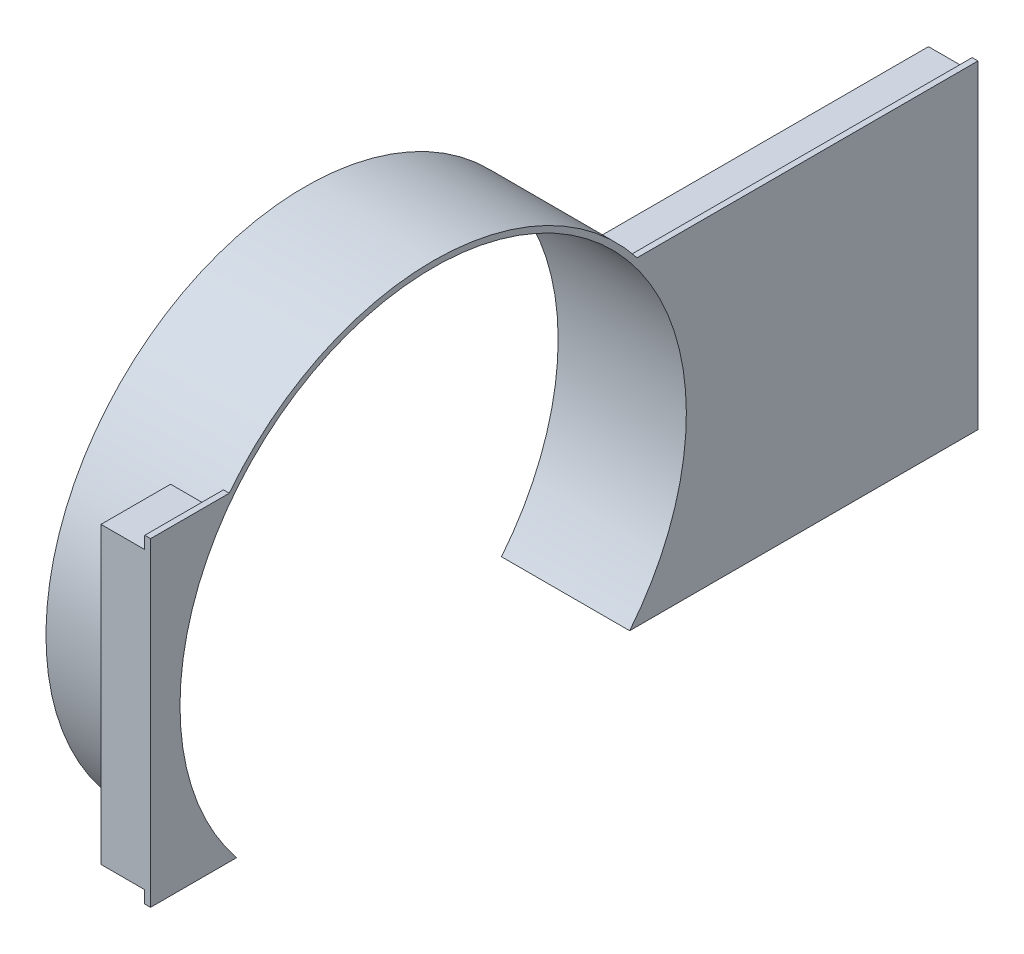
ISO-10303-21;
HEADER;
FILE_DESCRIPTION(('STEP AP214'),'2;1');
FILE_NAME('part.step','',(''),(''),'','','');
FILE_SCHEMA(('AUTOMOTIVE_DESIGN { 1 0 10303 214 1 1 1 1 }'));
ENDSEC;
DATA;
#1=APPLICATION_CONTEXT('core data for automotive mechanical design processes');
#2=APPLICATION_PROTOCOL_DEFINITION('international standard','automotive_design',2000,#1);
#3=PRODUCT_CONTEXT('',#1,'mechanical');
#4=PRODUCT('Part','Part','',(#3));
#5=PRODUCT_RELATED_PRODUCT_CATEGORY('part','',(#4));
#6=PRODUCT_DEFINITION_FORMATION('','',#4);
#7=PRODUCT_DEFINITION_CONTEXT('part definition',#1,'design');
#8=PRODUCT_DEFINITION('design','',#6,#7);
#9=PRODUCT_DEFINITION_SHAPE('','',#8);
#10=(LENGTH_UNIT() NAMED_UNIT(*) SI_UNIT(.MILLI.,.METRE.));
#11=(NAMED_UNIT(*) PLANE_ANGLE_UNIT() SI_UNIT($,.RADIAN.));
#12=(NAMED_UNIT(*) SI_UNIT($,.STERADIAN.) SOLID_ANGLE_UNIT());
#13=UNCERTAINTY_MEASURE_WITH_UNIT(LENGTH_MEASURE(1.E-05),#10,'distance_accuracy_value','');
#14=(GEOMETRIC_REPRESENTATION_CONTEXT(3) GLOBAL_UNCERTAINTY_ASSIGNED_CONTEXT((#13)) GLOBAL_UNIT_ASSIGNED_CONTEXT((#10,
#11,#12)) REPRESENTATION_CONTEXT('',''));
#15=CARTESIAN_POINT('',(0.,0.,0.));
#16=DIRECTION('',(0.,0.,1.));
#17=DIRECTION('',(1.,0.,0.));
#18=AXIS2_PLACEMENT_3D('',#15,#16,#17);
#19=CARTESIAN_POINT('',(0.,0.,0.));
#20=DIRECTION('',(1.,0.,0.));
#21=DIRECTION('',(0.,0.,-1.));
#22=AXIS2_PLACEMENT_3D('',#19,#20,#21);
#23=PLANE('',#22);
#24=DIRECTION('',(0.,-1.,0.));
#25=VECTOR('',#24,1.);
#26=CARTESIAN_POINT('',(0.,102.809999999998,119.460000064));
#27=LINE('',#26,#25);
#28=CARTESIAN_POINT('',(0.,102.809999999998,119.460000064));
#29=VERTEX_POINT('',#28);
#30=CARTESIAN_POINT('',(0.,6.78999988199818,119.460000064));
#31=VERTEX_POINT('',#30);
#32=EDGE_CURVE('E247',#29,#31,#27,.T.);
#33=ORIENTED_EDGE('',*,*,#32,.F.);
#34=DIRECTION('',(0.,0.,1.));
#35=VECTOR('',#34,1.);
#36=CARTESIAN_POINT('',(0.,102.809999999998,122.000000064));
#37=LINE('',#36,#35);
#38=CARTESIAN_POINT('',(0.,102.809999999998,99.8214534742541));
#39=VERTEX_POINT('',#38);
#40=EDGE_CURVE('E255',#39,#29,#37,.T.);
#41=ORIENTED_EDGE('',*,*,#40,.F.);
#42=CARTESIAN_POINT('',(0.,54.7999999999982,25.));
#43=DIRECTION('',(-1.,0.,0.));
#44=DIRECTION('',(0.,0.,-1.));
#45=AXIS2_PLACEMENT_3D('',#42,#43,#44);
#46=CIRCLE('',#45,88.9);
#47=CARTESIAN_POINT('',(0.,6.78999988199817,99.8214533985383));
#48=VERTEX_POINT('',#47);
#49=EDGE_CURVE('E368',#48,#39,#46,.T.);
#50=ORIENTED_EDGE('',*,*,#49,.F.);
#51=DIRECTION('',(0.,0.,-1.));
#52=VECTOR('',#51,1.);
#53=CARTESIAN_POINT('',(0.,6.78999988199818,122.000000064));
#54=LINE('',#53,#52);
#55=EDGE_CURVE('E284',#31,#48,#54,.T.);
#56=ORIENTED_EDGE('',*,*,#55,.F.);
#57=EDGE_LOOP('',(#33,#41,#50,#56));
#58=FACE_BOUND('',#57,.T.);
#59=ADVANCED_FACE('F35',(#58),#23,.F.);
#60=CARTESIAN_POINT('',(-15.,6.78999988199818,122.000000064));
#61=DIRECTION('',(0.,-1.,0.));
#62=DIRECTION('',(0.,0.,-1.));
#63=AXIS2_PLACEMENT_3D('',#60,#61,#62);
#64=PLANE('',#63);
#65=DIRECTION('',(1.,0.,0.));
#66=VECTOR('',#65,1.);
#67=CARTESIAN_POINT('',(-15.,6.78999988199818,119.460000064));
#68=LINE('',#67,#66);
#69=CARTESIAN_POINT('',(-15.,6.78999988199818,119.460000064));
#70=VERTEX_POINT('',#69);
#71=EDGE_CURVE('E243',#70,#31,#68,.T.);
#72=ORIENTED_EDGE('',*,*,#71,.T.);
#73=ORIENTED_EDGE('',*,*,#55,.T.);
#74=DIRECTION('',(1.,0.,0.));
#75=VECTOR('',#74,1.);
#76=CARTESIAN_POINT('',(-15.,6.78999988199817,99.8214533985383));
#77=LINE('',#76,#75);
#78=CARTESIAN_POINT('',(-15.,6.78999988199817,99.8214533985383));
#79=VERTEX_POINT('',#78);
#80=EDGE_CURVE('E290',#79,#48,#77,.T.);
#81=ORIENTED_EDGE('',*,*,#80,.F.);
#82=DIRECTION('',(0.,0.,-1.));
#83=VECTOR('',#82,1.);
#84=CARTESIAN_POINT('',(-15.,6.78999988199818,122.000000064));
#85=LINE('',#84,#83);
#86=EDGE_CURVE('E288',#70,#79,#85,.T.);
#87=ORIENTED_EDGE('',*,*,#86,.F.);
#88=EDGE_LOOP('',(#72,#73,#81,#87));
#89=FACE_BOUND('',#88,.T.);
#90=ADVANCED_FACE('F399',(#89),#64,.F.);
#91=CARTESIAN_POINT('',(-15.,102.809999999998,122.000000064));
#92=DIRECTION('',(0.,1.,0.));
#93=DIRECTION('',(0.,0.,1.));
#94=AXIS2_PLACEMENT_3D('',#91,#92,#93);
#95=PLANE('',#94);
#96=DIRECTION('',(1.,0.,0.));
#97=VECTOR('',#96,1.);
#98=CARTESIAN_POINT('',(-15.,102.809999999998,119.460000064));
#99=LINE('',#98,#97);
#100=CARTESIAN_POINT('',(-15.,102.809999999998,119.460000064));
#101=VERTEX_POINT('',#100);
#102=EDGE_CURVE('E240',#101,#29,#99,.T.);
#103=ORIENTED_EDGE('',*,*,#102,.F.);
#104=DIRECTION('',(0.,0.,1.));
#105=VECTOR('',#104,1.);
#106=CARTESIAN_POINT('',(-15.,102.809999999998,122.000000064));
#107=LINE('',#106,#105);
#108=CARTESIAN_POINT('',(-15.,102.809999999998,99.8214534742541));
#109=VERTEX_POINT('',#108);
#110=EDGE_CURVE('E252',#109,#101,#107,.T.);
#111=ORIENTED_EDGE('',*,*,#110,.F.);
#112=DIRECTION('',(1.,0.,0.));
#113=VECTOR('',#112,1.);
#114=CARTESIAN_POINT('',(-15.,102.809999999998,99.8214534742541));
#115=LINE('',#114,#113);
#116=EDGE_CURVE('E278',#109,#39,#115,.T.);
#117=ORIENTED_EDGE('',*,*,#116,.T.);
#118=ORIENTED_EDGE('',*,*,#40,.T.);
#119=EDGE_LOOP('',(#103,#111,#117,#118));
#120=FACE_BOUND('',#119,.T.);
#121=ADVANCED_FACE('F251',(#120),#95,.F.);
#122=DIRECTION('',(0.,1.,0.));
#123=VECTOR('',#122,1.);
#124=CARTESIAN_POINT('',(0.,102.217471492164,-159.460000064));
#125=LINE('',#124,#123);
#126=CARTESIAN_POINT('',(0.,6.79,-159.460000064));
#127=VERTEX_POINT('',#126);
#128=CARTESIAN_POINT('',(0.,102.217471492164,-159.460000064));
#129=VERTEX_POINT('',#128);
#130=EDGE_CURVE('E256',#127,#129,#125,.T.);
#131=ORIENTED_EDGE('',*,*,#130,.F.);
#132=DIRECTION('',(0.,0.,-1.));
#133=VECTOR('',#132,1.);
#134=CARTESIAN_POINT('',(0.,6.79,-162.000000064));
#135=LINE('',#134,#133);
#136=CARTESIAN_POINT('',(0.,6.79,-112.470000064));
#137=VERTEX_POINT('',#136);
#138=EDGE_CURVE('E499',#137,#127,#135,.T.);
#139=ORIENTED_EDGE('',*,*,#138,.F.);
#140=DIRECTION('',(0.,1.,0.));
#141=VECTOR('',#140,1.);
#142=CARTESIAN_POINT('',(0.,0.,-112.470000064));
#143=LINE('',#142,#141);
#144=CARTESIAN_POINT('',(0.,54.5037357460822,-112.470000064));
#145=VERTEX_POINT('',#144);
#146=EDGE_CURVE('E522',#137,#145,#143,.T.);
#147=ORIENTED_EDGE('',*,*,#146,.T.);
#148=DIRECTION('',(0.,1.,0.));
#149=VECTOR('',#148,1.);
#150=CARTESIAN_POINT('',(0.,0.,-112.470000064));
#151=LINE('',#150,#149);
#152=CARTESIAN_POINT('',(0.,102.217471492164,-112.470000064));
#153=VERTEX_POINT('',#152);
#154=EDGE_CURVE('E539',#145,#153,#151,.T.);
#155=ORIENTED_EDGE('',*,*,#154,.T.);
#156=DIRECTION('',(0.,0.,1.));
#157=VECTOR('',#156,1.);
#158=CARTESIAN_POINT('',(0.,102.217471492164,-162.000000064));
#159=LINE('',#158,#157);
#160=EDGE_CURVE('E467',#129,#153,#159,.T.);
#161=ORIENTED_EDGE('',*,*,#160,.F.);
#162=EDGE_LOOP('',(#131,#139,#147,#155,#161));
#163=FACE_BOUND('',#162,.T.);
#164=ADVANCED_FACE('F578',(#163),#23,.F.);
#165=CARTESIAN_POINT('',(-15.,6.79,-162.000000064));
#166=DIRECTION('',(0.,-1.,0.));
#167=DIRECTION('',(0.,0.,-1.));
#168=AXIS2_PLACEMENT_3D('',#165,#166,#167);
#169=PLANE('',#168);
#170=DIRECTION('',(1.,0.,0.));
#171=VECTOR('',#170,1.);
#172=CARTESIAN_POINT('',(-15.,6.79,-159.460000064));
#173=LINE('',#172,#171);
#174=CARTESIAN_POINT('',(-15.,6.79,-159.460000064));
#175=VERTEX_POINT('',#174);
#176=EDGE_CURVE('E553',#175,#127,#173,.T.);
#177=ORIENTED_EDGE('',*,*,#176,.F.);
#178=DIRECTION('',(0.,0.,-1.));
#179=VECTOR('',#178,1.);
#180=CARTESIAN_POINT('',(-15.,6.79,-162.000000064));
#181=LINE('',#180,#179);
#182=CARTESIAN_POINT('',(-15.,6.79,-112.470000064));
#183=VERTEX_POINT('',#182);
#184=EDGE_CURVE('E492',#183,#175,#181,.T.);
#185=ORIENTED_EDGE('',*,*,#184,.F.);
#186=DIRECTION('',(1.,0.,0.));
#187=VECTOR('',#186,1.);
#188=CARTESIAN_POINT('',(-15.,6.79,-112.470000064));
#189=LINE('',#188,#187);
#190=EDGE_CURVE('E519',#183,#137,#189,.T.);
#191=ORIENTED_EDGE('',*,*,#190,.T.);
#192=ORIENTED_EDGE('',*,*,#138,.T.);
#193=EDGE_LOOP('',(#177,#185,#191,#192));
#194=FACE_BOUND('',#193,.T.);
#195=ADVANCED_FACE('F584',(#194),#169,.F.);
#196=CARTESIAN_POINT('',(-15.,102.217471492164,-162.000000064));
#197=DIRECTION('',(0.,1.,0.));
#198=DIRECTION('',(0.,0.,1.));
#199=AXIS2_PLACEMENT_3D('',#196,#197,#198);
#200=PLANE('',#199);
#201=DIRECTION('',(1.,0.,0.));
#202=VECTOR('',#201,1.);
#203=CARTESIAN_POINT('',(-15.,102.217471492164,-159.460000064));
#204=LINE('',#203,#202);
#205=CARTESIAN_POINT('',(-15.,102.217471492164,-159.460000064));
#206=VERTEX_POINT('',#205);
#207=EDGE_CURVE('E50',#206,#129,#204,.T.);
#208=ORIENTED_EDGE('',*,*,#207,.T.);
#209=ORIENTED_EDGE('',*,*,#160,.T.);
#210=DIRECTION('',(-1.,0.,0.));
#211=VECTOR('',#210,1.);
#212=CARTESIAN_POINT('',(-15.,102.217471492164,-112.470000064));
#213=LINE('',#212,#211);
#214=CARTESIAN_POINT('',(-15.,102.217471492164,-112.470000064));
#215=VERTEX_POINT('',#214);
#216=EDGE_CURVE('E542',#153,#215,#213,.T.);
#217=ORIENTED_EDGE('',*,*,#216,.T.);
#218=DIRECTION('',(0.,0.,1.));
#219=VECTOR('',#218,1.);
#220=CARTESIAN_POINT('',(-15.,102.217471492164,-162.000000064));
#221=LINE('',#220,#219);
#222=EDGE_CURVE('E469',#206,#215,#221,.T.);
#223=ORIENTED_EDGE('',*,*,#222,.F.);
#224=EDGE_LOOP('',(#208,#209,#217,#223));
#225=FACE_BOUND('',#224,.T.);
#226=ADVANCED_FACE('F569',(#225),#200,.F.);
#227=DIRECTION('',(0.,1.,0.));
#228=VECTOR('',#227,1.);
#229=CARTESIAN_POINT('',(0.,0.,-109.930000064));
#230=LINE('',#229,#228);
#231=CARTESIAN_POINT('',(-1.17961196366423E-13,54.5037357460825,-109.930000064));
#232=VERTEX_POINT('',#231);
#233=CARTESIAN_POINT('',(0.,102.217471492164,-109.930000064));
#234=VERTEX_POINT('',#233);
#235=EDGE_CURVE('E545',#232,#234,#230,.T.);
#236=ORIENTED_EDGE('',*,*,#235,.F.);
#237=DIRECTION('',(0.,1.,0.));
#238=VECTOR('',#237,1.);
#239=CARTESIAN_POINT('',(0.,0.,-109.930000064));
#240=LINE('',#239,#238);
#241=CARTESIAN_POINT('',(0.,6.79,-109.930000064));
#242=VERTEX_POINT('',#241);
#243=EDGE_CURVE('E527',#242,#232,#240,.T.);
#244=ORIENTED_EDGE('',*,*,#243,.F.);
#245=CARTESIAN_POINT('',(0.,6.79,-49.8214534742555));
#246=VERTEX_POINT('',#245);
#247=EDGE_CURVE('E487',#246,#242,#135,.T.);
#248=ORIENTED_EDGE('',*,*,#247,.F.);
#249=CARTESIAN_POINT('',(0.,102.217471492164,-50.1983603364436));
#250=VERTEX_POINT('',#249);
#251=EDGE_CURVE('E369',#250,#246,#46,.T.);
#252=ORIENTED_EDGE('',*,*,#251,.F.);
#253=EDGE_CURVE('E471',#234,#250,#159,.T.);
#254=ORIENTED_EDGE('',*,*,#253,.F.);
#255=EDGE_LOOP('',(#236,#244,#248,#252,#254));
#256=FACE_BOUND('',#255,.T.);
#257=ADVANCED_FACE('F596',(#256),#23,.F.);
#258=DIRECTION('',(-1.,0.,0.));
#259=VECTOR('',#258,1.);
#260=CARTESIAN_POINT('',(-15.,102.217471492164,-109.930000064));
#261=LINE('',#260,#259);
#262=CARTESIAN_POINT('',(-15.,102.217471492164,-109.930000064));
#263=VERTEX_POINT('',#262);
#264=EDGE_CURVE('E547',#234,#263,#261,.T.);
#265=ORIENTED_EDGE('',*,*,#264,.F.);
#266=ORIENTED_EDGE('',*,*,#253,.T.);
#267=DIRECTION('',(1.,0.,0.));
#268=VECTOR('',#267,1.);
#269=CARTESIAN_POINT('',(-15.,102.217471492164,-50.1983603364436));
#270=LINE('',#269,#268);
#271=CARTESIAN_POINT('',(-15.,102.217471492164,-50.1983603364436));
#272=VERTEX_POINT('',#271);
#273=EDGE_CURVE('E480',#272,#250,#270,.T.);
#274=ORIENTED_EDGE('',*,*,#273,.F.);
#275=EDGE_CURVE('E466',#263,#272,#221,.T.);
#276=ORIENTED_EDGE('',*,*,#275,.F.);
#277=EDGE_LOOP('',(#265,#266,#274,#276));
#278=FACE_BOUND('',#277,.T.);
#279=ADVANCED_FACE('F604',(#278),#200,.F.);
#280=DIRECTION('',(1.,0.,0.));
#281=VECTOR('',#280,1.);
#282=CARTESIAN_POINT('',(-15.,6.79,-109.930000064));
#283=LINE('',#282,#281);
#284=CARTESIAN_POINT('',(-15.,6.79000000000001,-109.930000064));
#285=VERTEX_POINT('',#284);
#286=EDGE_CURVE('E525',#285,#242,#283,.T.);
#287=ORIENTED_EDGE('',*,*,#286,.F.);
#288=CARTESIAN_POINT('',(-15.,6.78999999999998,-49.8214534742555));
#289=VERTEX_POINT('',#288);
#290=EDGE_CURVE('E493',#289,#285,#181,.T.);
#291=ORIENTED_EDGE('',*,*,#290,.F.);
#292=DIRECTION('',(1.,0.,0.));
#293=VECTOR('',#292,1.);
#294=CARTESIAN_POINT('',(-15.,6.79000000000009,-49.8214534742553));
#295=LINE('',#294,#293);
#296=EDGE_CURVE('E496',#289,#246,#295,.T.);
#297=ORIENTED_EDGE('',*,*,#296,.T.);
#298=ORIENTED_EDGE('',*,*,#247,.T.);
#299=EDGE_LOOP('',(#287,#291,#297,#298));
#300=FACE_BOUND('',#299,.T.);
#301=ADVANCED_FACE('F593',(#300),#169,.F.);
#302=CARTESIAN_POINT('',(-42.000000074,54.7999999999982,25.));
#303=DIRECTION('',(1.,0.,0.));
#304=DIRECTION('',(0.,0.,-1.));
#305=AXIS2_PLACEMENT_3D('',#302,#303,#304);
#306=CYLINDRICAL_SURFACE('',#305,88.9);
#307=ORIENTED_EDGE('',*,*,#273,.T.);
#308=ORIENTED_EDGE('',*,*,#251,.T.);
#309=ORIENTED_EDGE('',*,*,#296,.F.);
#310=CARTESIAN_POINT('',(-15.,54.7999999996239,24.9999999994585));
#311=DIRECTION('',(1.,0.,0.));
#312=DIRECTION('',(0.,0.,1.));
#313=AXIS2_PLACEMENT_3D('',#310,#311,#312);
#314=CIRCLE('',#313,88.8999999993419);
#315=CARTESIAN_POINT('',(-15.,4.25000000000001,-48.1293887571897));
#316=VERTEX_POINT('',#315);
#317=EDGE_CURVE('E489',#316,#289,#314,.T.);
#318=ORIENTED_EDGE('',*,*,#317,.F.);
#319=DIRECTION('',(1.,0.,0.));
#320=VECTOR('',#319,1.);
#321=CARTESIAN_POINT('',(-15.,4.25,-48.1293887571897));
#322=LINE('',#321,#320);
#323=CARTESIAN_POINT('',(0.,4.25,-48.1293887571897));
#324=VERTEX_POINT('',#323);
#325=EDGE_CURVE('E414',#316,#324,#322,.T.);
#326=ORIENTED_EDGE('',*,*,#325,.T.);
#327=CARTESIAN_POINT('',(0.,0.,-45.0012142751838));
#328=VERTEX_POINT('',#327);
#329=EDGE_CURVE('E354',#324,#328,#46,.T.);
#330=ORIENTED_EDGE('',*,*,#329,.T.);
#331=DIRECTION('',(1.,0.,0.));
#332=VECTOR('',#331,1.);
#333=CARTESIAN_POINT('',(-42.000000074,0.,-45.0012142751838));
#334=LINE('',#333,#332);
#335=CARTESIAN_POINT('',(-42.000000074,0.,-45.0012142751838));
#336=VERTEX_POINT('',#335);
#337=EDGE_CURVE('E372',#336,#328,#334,.T.);
#338=ORIENTED_EDGE('',*,*,#337,.F.);
#339=CARTESIAN_POINT('',(-42.000000074,54.7999999999982,25.));
#340=DIRECTION('',(-1.,0.,0.));
#341=DIRECTION('',(0.,0.,-1.));
#342=AXIS2_PLACEMENT_3D('',#339,#340,#341);
#343=CIRCLE('',#342,88.9);
#344=CARTESIAN_POINT('',(-42.000000074,0.,95.0012142751838));
#345=VERTEX_POINT('',#344);
#346=EDGE_CURVE('E361',#345,#336,#343,.T.);
#347=ORIENTED_EDGE('',*,*,#346,.F.);
#348=DIRECTION('',(1.,0.,0.));
#349=VECTOR('',#348,1.);
#350=CARTESIAN_POINT('',(-42.000000074,0.,95.0012142751838));
#351=LINE('',#350,#349);
#352=CARTESIAN_POINT('',(0.,-1.82098467966616E-12,95.0012142751824));
#353=VERTEX_POINT('',#352);
#354=EDGE_CURVE('E43',#345,#353,#351,.T.);
#355=ORIENTED_EDGE('',*,*,#354,.T.);
#356=CARTESIAN_POINT('',(0.,4.24999988199818,98.129388675622));
#357=VERTEX_POINT('',#356);
#358=EDGE_CURVE('E359',#353,#357,#46,.T.);
#359=ORIENTED_EDGE('',*,*,#358,.T.);
#360=DIRECTION('',(1.,0.,0.));
#361=VECTOR('',#360,1.);
#362=CARTESIAN_POINT('',(-15.,4.24999988199818,98.129388675622));
#363=LINE('',#362,#361);
#364=CARTESIAN_POINT('',(-15.,4.24999988199818,98.129388675622));
#365=VERTEX_POINT('',#364);
#366=EDGE_CURVE('E298',#365,#357,#363,.T.);
#367=ORIENTED_EDGE('',*,*,#366,.F.);
#368=CARTESIAN_POINT('',(-15.,54.8000000003952,24.9999999994041));
#369=DIRECTION('',(1.,0.,0.));
#370=DIRECTION('',(0.,0.,-1.));
#371=AXIS2_PLACEMENT_3D('',#368,#369,#370);
#372=CIRCLE('',#371,88.9000000007159);
#373=EDGE_CURVE('E281',#79,#365,#372,.T.);
#374=ORIENTED_EDGE('',*,*,#373,.F.);
#375=ORIENTED_EDGE('',*,*,#80,.T.);
#376=ORIENTED_EDGE('',*,*,#49,.T.);
#377=ORIENTED_EDGE('',*,*,#116,.F.);
#378=CARTESIAN_POINT('',(-15.,54.7999999999718,24.9999999999599));
#379=DIRECTION('',(1.,0.,0.));
#380=DIRECTION('',(0.,0.,1.));
#381=AXIS2_PLACEMENT_3D('',#378,#379,#380);
#382=CIRCLE('',#381,88.900000000048);
#383=CARTESIAN_POINT('',(-15.,105.349999999998,98.1293887571882));
#384=VERTEX_POINT('',#383);
#385=EDGE_CURVE('E261',#384,#109,#382,.T.);
#386=ORIENTED_EDGE('',*,*,#385,.F.);
#387=DIRECTION('',(1.,0.,0.));
#388=VECTOR('',#387,1.);
#389=CARTESIAN_POINT('',(-15.,105.349999999998,98.1293887571882));
#390=LINE('',#389,#388);
#391=CARTESIAN_POINT('',(0.,105.349999999998,98.1293887571882));
#392=VERTEX_POINT('',#391);
#393=EDGE_CURVE('E265',#384,#392,#390,.T.);
#394=ORIENTED_EDGE('',*,*,#393,.T.);
#395=CARTESIAN_POINT('',(0.,109.599999999998,95.0012142751822));
#396=VERTEX_POINT('',#395);
#397=EDGE_CURVE('E402',#392,#396,#46,.T.);
#398=ORIENTED_EDGE('',*,*,#397,.T.);
#399=DIRECTION('',(-1.,0.,0.));
#400=VECTOR('',#399,1.);
#401=CARTESIAN_POINT('',(2.000000064,109.599999999998,95.0012142751822));
#402=LINE('',#401,#400);
#403=CARTESIAN_POINT('',(2.000000064,109.599999999998,95.0012142751822));
#404=VERTEX_POINT('',#403);
#405=EDGE_CURVE('E351',#404,#396,#402,.T.);
#406=ORIENTED_EDGE('',*,*,#405,.F.);
#407=CARTESIAN_POINT('',(2.000000064,54.7999999999982,25.));
#408=DIRECTION('',(1.,0.,0.));
#409=DIRECTION('',(0.,0.,-1.));
#410=AXIS2_PLACEMENT_3D('',#407,#408,#409);
#411=CIRCLE('',#410,88.9);
#412=CARTESIAN_POINT('',(2.000000064,109.599999999998,-45.0012142751823));
#413=VERTEX_POINT('',#412);
#414=EDGE_CURVE('E301',#413,#404,#411,.T.);
#415=ORIENTED_EDGE('',*,*,#414,.F.);
#416=DIRECTION('',(-1.,0.,0.));
#417=VECTOR('',#416,1.);
#418=CARTESIAN_POINT('',(2.000000064,109.599999999998,-45.0012142751823));
#419=LINE('',#418,#417);
#420=CARTESIAN_POINT('',(0.,109.599999999998,-45.0012142751823));
#421=VERTEX_POINT('',#420);
#422=EDGE_CURVE('E321',#413,#421,#419,.T.);
#423=ORIENTED_EDGE('',*,*,#422,.T.);
#424=CARTESIAN_POINT('',(0.,105.349999999998,-48.1293887571885));
#425=VERTEX_POINT('',#424);
#426=EDGE_CURVE('E370',#421,#425,#46,.T.);
#427=ORIENTED_EDGE('',*,*,#426,.T.);
#428=DIRECTION('',(1.,0.,0.));
#429=VECTOR('',#428,1.);
#430=CARTESIAN_POINT('',(-15.,105.349999999998,-48.1293887571885));
#431=LINE('',#430,#429);
#432=CARTESIAN_POINT('',(-15.,105.349999999998,-48.1293887571885));
#433=VERTEX_POINT('',#432);
#434=EDGE_CURVE('E477',#433,#425,#431,.T.);
#435=ORIENTED_EDGE('',*,*,#434,.F.);
#436=CARTESIAN_POINT('',(-15.,54.7999999996098,25.0000000005884));
#437=DIRECTION('',(1.,0.,0.));
#438=DIRECTION('',(0.,0.,1.));
#439=AXIS2_PLACEMENT_3D('',#436,#437,#438);
#440=CIRCLE('',#439,88.9000000007049);
#441=EDGE_CURVE('E514',#272,#433,#440,.T.);
#442=ORIENTED_EDGE('',*,*,#441,.F.);
#443=EDGE_LOOP('',(#307,#308,#309,#318,#326,#330,#338,#347,#355,#359,#367,#374,#375,#376,#377,
#386,#394,#398,#406,#415,#423,#427,#435,#442));
#444=FACE_BOUND('',#443,.T.);
#445=ADVANCED_FACE('F379',(#444),#306,.T.);
#446=DIRECTION('',(0.,1.,0.));
#447=VECTOR('',#446,1.);
#448=CARTESIAN_POINT('',(0.,0.,-162.000000064));
#449=LINE('',#448,#447);
#450=CARTESIAN_POINT('',(0.,105.349999999998,-162.000000064));
#451=VERTEX_POINT('',#450);
#452=CARTESIAN_POINT('',(0.,109.599999999998,-162.000000064));
#453=VERTEX_POINT('',#452);
#454=EDGE_CURVE('E332',#451,#453,#449,.T.);
#455=ORIENTED_EDGE('',*,*,#454,.F.);
#456=DIRECTION('',(0.,0.,-1.));
#457=VECTOR('',#456,1.);
#458=CARTESIAN_POINT('',(0.,105.349999999998,-162.000000064));
#459=LINE('',#458,#457);
#460=EDGE_CURVE('E462',#425,#451,#459,.T.);
#461=ORIENTED_EDGE('',*,*,#460,.F.);
#462=ORIENTED_EDGE('',*,*,#426,.F.);
#463=DIRECTION('',(0.,0.,1.));
#464=VECTOR('',#463,1.);
#465=CARTESIAN_POINT('',(0.,109.599999999998,0.));
#466=LINE('',#465,#464);
#467=EDGE_CURVE('E305',#453,#421,#466,.T.);
#468=ORIENTED_EDGE('',*,*,#467,.F.);
#469=EDGE_LOOP('',(#455,#461,#462,#468));
#470=FACE_BOUND('',#469,.T.);
#471=ADVANCED_FACE('F461',(#470),#23,.F.);
#472=CARTESIAN_POINT('',(0.,0.,-162.000000064));
#473=VERTEX_POINT('',#472);
#474=CARTESIAN_POINT('',(0.,4.25,-162.000000064));
#475=VERTEX_POINT('',#474);
#476=EDGE_CURVE('E333',#473,#475,#449,.T.);
#477=ORIENTED_EDGE('',*,*,#476,.F.);
#478=DIRECTION('',(0.,0.,-1.));
#479=VECTOR('',#478,1.);
#480=CARTESIAN_POINT('',(0.,0.,0.));
#481=LINE('',#480,#479);
#482=EDGE_CURVE('E330',#328,#473,#481,.T.);
#483=ORIENTED_EDGE('',*,*,#482,.F.);
#484=ORIENTED_EDGE('',*,*,#329,.F.);
#485=DIRECTION('',(0.,0.,1.));
#486=VECTOR('',#485,1.);
#487=CARTESIAN_POINT('',(0.,4.25,-162.000000064));
#488=LINE('',#487,#486);
#489=EDGE_CURVE('E482',#475,#324,#488,.T.);
#490=ORIENTED_EDGE('',*,*,#489,.F.);
#491=EDGE_LOOP('',(#477,#483,#484,#490));
#492=FACE_BOUND('',#491,.T.);
#493=ADVANCED_FACE('F417',(#492),#23,.F.);
#494=DIRECTION('',(0.,0.,-1.));
#495=VECTOR('',#494,1.);
#496=CARTESIAN_POINT('',(0.,105.349999999998,98.1293887571882));
#497=LINE('',#496,#495);
#498=CARTESIAN_POINT('',(0.,105.349999999998,122.000000064));
#499=VERTEX_POINT('',#498);
#500=EDGE_CURVE('E267',#499,#392,#497,.T.);
#501=ORIENTED_EDGE('',*,*,#500,.F.);
#502=DIRECTION('',(0.,-1.,0.));
#503=VECTOR('',#502,1.);
#504=CARTESIAN_POINT('',(0.,0.,122.000000064));
#505=LINE('',#504,#503);
#506=CARTESIAN_POINT('',(0.,109.599999999999,122.000000064));
#507=VERTEX_POINT('',#506);
#508=EDGE_CURVE('E324',#507,#499,#505,.T.);
#509=ORIENTED_EDGE('',*,*,#508,.F.);
#510=DIRECTION('',(0.,0.,1.));
#511=VECTOR('',#510,1.);
#512=CARTESIAN_POINT('',(0.,109.6,1.27770671624085E-12));
#513=LINE('',#512,#511);
#514=EDGE_CURVE('E300',#396,#507,#513,.T.);
#515=ORIENTED_EDGE('',*,*,#514,.F.);
#516=ORIENTED_EDGE('',*,*,#397,.F.);
#517=EDGE_LOOP('',(#501,#509,#515,#516));
#518=FACE_BOUND('',#517,.T.);
#519=ADVANCED_FACE('F446',(#518),#23,.F.);
#520=DIRECTION('',(0.,0.,1.));
#521=VECTOR('',#520,1.);
#522=CARTESIAN_POINT('',(0.,4.24999988199818,98.129388675622));
#523=LINE('',#522,#521);
#524=CARTESIAN_POINT('',(0.,4.24999988199818,122.000000064));
#525=VERTEX_POINT('',#524);
#526=EDGE_CURVE('E280',#357,#525,#523,.T.);
#527=ORIENTED_EDGE('',*,*,#526,.F.);
#528=ORIENTED_EDGE('',*,*,#358,.F.);
#529=DIRECTION('',(0.,-7.106723131739E-13,1.));
#530=VECTOR('',#529,1.);
#531=CARTESIAN_POINT('',(0.,6.56898036065456E-11,0.));
#532=LINE('',#531,#530);
#533=CARTESIAN_POINT('',(0.,-1.04744440334534E-12,122.000000064));
#534=VERTEX_POINT('',#533);
#535=EDGE_CURVE('E327',#353,#534,#532,.T.);
#536=ORIENTED_EDGE('',*,*,#535,.T.);
#537=EDGE_CURVE('E323',#525,#534,#505,.T.);
#538=ORIENTED_EDGE('',*,*,#537,.F.);
#539=EDGE_LOOP('',(#527,#528,#536,#538));
#540=FACE_BOUND('',#539,.T.);
#541=ADVANCED_FACE('F389',(#540),#23,.F.);
#542=CARTESIAN_POINT('',(-42.000000074,54.7999999999982,25.));
#543=DIRECTION('',(1.,0.,0.));
#544=DIRECTION('',(0.,0.,-1.));
#545=AXIS2_PLACEMENT_3D('',#542,#543,#544);
#546=CYLINDRICAL_SURFACE('',#545,86.899999936);
#547=DIRECTION('',(1.,0.,0.));
#548=VECTOR('',#547,1.);
#549=CARTESIAN_POINT('',(-42.000000074,0.,-42.4430870354924));
#550=LINE('',#549,#548);
#551=CARTESIAN_POINT('',(-42.000000074,0.,-42.4430870354924));
#552=VERTEX_POINT('',#551);
#553=CARTESIAN_POINT('',(2.000000064,0.,-42.4430870354924));
#554=VERTEX_POINT('',#553);
#555=EDGE_CURVE('E365',#552,#554,#550,.T.);
#556=ORIENTED_EDGE('',*,*,#555,.T.);
#557=CARTESIAN_POINT('',(2.000000064,54.7999999999982,25.));
#558=DIRECTION('',(1.,0.,0.));
#559=DIRECTION('',(0.,0.,-1.));
#560=AXIS2_PLACEMENT_3D('',#557,#558,#559);
#561=CIRCLE('',#560,86.899999936);
#562=CARTESIAN_POINT('',(2.000000064,0.,92.4430870354923));
#563=VERTEX_POINT('',#562);
#564=EDGE_CURVE('E312',#554,#563,#561,.T.);
#565=ORIENTED_EDGE('',*,*,#564,.T.);
#566=DIRECTION('',(1.,0.,0.));
#567=VECTOR('',#566,1.);
#568=CARTESIAN_POINT('',(-42.000000074,0.,92.4430870354923));
#569=LINE('',#568,#567);
#570=CARTESIAN_POINT('',(-42.000000074,0.,92.4430870354923));
#571=VERTEX_POINT('',#570);
#572=EDGE_CURVE('E11',#571,#563,#569,.T.);
#573=ORIENTED_EDGE('',*,*,#572,.F.);
#574=CARTESIAN_POINT('',(-42.000000074,54.7999999999982,25.));
#575=DIRECTION('',(1.,0.,0.));
#576=DIRECTION('',(0.,0.,-1.));
#577=AXIS2_PLACEMENT_3D('',#574,#575,#576);
#578=CIRCLE('',#577,86.899999936);
#579=EDGE_CURVE('E355',#552,#571,#578,.T.);
#580=ORIENTED_EDGE('',*,*,#579,.F.);
#581=EDGE_LOOP('',(#556,#565,#573,#580));
#582=FACE_BOUND('',#581,.T.);
#583=ADVANCED_FACE('F37',(#582),#546,.F.);
#584=CARTESIAN_POINT('',(-42.000000074,0.,92.4430870354923));
#585=DIRECTION('',(0.,1.,0.));
#586=DIRECTION('',(0.,0.,1.));
#587=AXIS2_PLACEMENT_3D('',#584,#585,#586);
#588=PLANE('',#587);
#589=ORIENTED_EDGE('',*,*,#572,.T.);
#590=DIRECTION('',(0.,-7.106723131739E-13,1.));
#591=VECTOR('',#590,1.);
#592=CARTESIAN_POINT('',(2.000000064,6.56898036065456E-11,0.));
#593=LINE('',#592,#591);
#594=CARTESIAN_POINT('',(2.000000064,-1.04744440334534E-12,122.000000064));
#595=VERTEX_POINT('',#594);
#596=EDGE_CURVE('E309',#563,#595,#593,.T.);
#597=ORIENTED_EDGE('',*,*,#596,.T.);
#598=DIRECTION('',(-1.,0.,0.));
#599=VECTOR('',#598,1.);
#600=CARTESIAN_POINT('',(2.000000064,-1.04744440334534E-12,122.000000064));
#601=LINE('',#600,#599);
#602=EDGE_CURVE('E345',#595,#534,#601,.T.);
#603=ORIENTED_EDGE('',*,*,#602,.T.);
#604=ORIENTED_EDGE('',*,*,#535,.F.);
#605=ORIENTED_EDGE('',*,*,#354,.F.);
#606=DIRECTION('',(0.,0.,1.));
#607=VECTOR('',#606,1.);
#608=CARTESIAN_POINT('',(-42.000000074,0.,92.4430870354923));
#609=LINE('',#608,#607);
#610=EDGE_CURVE('E358',#571,#345,#609,.T.);
#611=ORIENTED_EDGE('',*,*,#610,.F.);
#612=EDGE_LOOP('',(#589,#597,#603,#604,#605,#611));
#613=FACE_BOUND('',#612,.T.);
#614=ADVANCED_FACE('F384',(#613),#588,.F.);
#615=CARTESIAN_POINT('',(-42.000000074,0.,-45.0012142751838));
#616=DIRECTION('',(0.,1.,0.));
#617=DIRECTION('',(0.,0.,1.));
#618=AXIS2_PLACEMENT_3D('',#615,#616,#617);
#619=PLANE('',#618);
#620=DIRECTION('',(-1.,0.,0.));
#621=VECTOR('',#620,1.);
#622=CARTESIAN_POINT('',(2.000000064,0.,-162.000000064));
#623=LINE('',#622,#621);
#624=CARTESIAN_POINT('',(2.000000064,0.,-162.000000064));
#625=VERTEX_POINT('',#624);
#626=EDGE_CURVE('E342',#625,#473,#623,.T.);
#627=ORIENTED_EDGE('',*,*,#626,.F.);
#628=DIRECTION('',(0.,0.,-1.));
#629=VECTOR('',#628,1.);
#630=CARTESIAN_POINT('',(2.000000064,0.,0.));
#631=LINE('',#630,#629);
#632=EDGE_CURVE('E315',#554,#625,#631,.T.);
#633=ORIENTED_EDGE('',*,*,#632,.F.);
#634=ORIENTED_EDGE('',*,*,#555,.F.);
#635=DIRECTION('',(0.,0.,1.));
#636=VECTOR('',#635,1.);
#637=CARTESIAN_POINT('',(-42.000000074,0.,-45.0012142751838));
#638=LINE('',#637,#636);
#639=EDGE_CURVE('E363',#336,#552,#638,.T.);
#640=ORIENTED_EDGE('',*,*,#639,.F.);
#641=ORIENTED_EDGE('',*,*,#337,.T.);
#642=ORIENTED_EDGE('',*,*,#482,.T.);
#643=EDGE_LOOP('',(#627,#633,#634,#640,#641,#642));
#644=FACE_BOUND('',#643,.T.);
#645=ADVANCED_FACE('F420',(#644),#619,.F.);
#646=CARTESIAN_POINT('',(-42.000000074,54.7999999999982,25.));
#647=DIRECTION('',(1.,0.,0.));
#648=DIRECTION('',(0.,0.,-1.));
#649=AXIS2_PLACEMENT_3D('',#646,#647,#648);
#650=PLANE('',#649);
#651=ORIENTED_EDGE('',*,*,#579,.T.);
#652=ORIENTED_EDGE('',*,*,#610,.T.);
#653=ORIENTED_EDGE('',*,*,#346,.T.);
#654=ORIENTED_EDGE('',*,*,#639,.T.);
#655=EDGE_LOOP('',(#651,#652,#653,#654));
#656=FACE_BOUND('',#655,.T.);
#657=ADVANCED_FACE('F425',(#656),#650,.F.);
#658=CARTESIAN_POINT('',(2.000000064,109.6,1.27770671624085E-12));
#659=DIRECTION('',(0.,-1.,0.));
#660=DIRECTION('',(0.,0.,-1.));
#661=AXIS2_PLACEMENT_3D('',#658,#659,#660);
#662=PLANE('',#661);
#663=ORIENTED_EDGE('',*,*,#514,.T.);
#664=DIRECTION('',(-1.,0.,0.));
#665=VECTOR('',#664,1.);
#666=CARTESIAN_POINT('',(2.000000064,109.599999999999,122.000000064));
#667=LINE('',#666,#665);
#668=CARTESIAN_POINT('',(2.000000064,109.599999999999,122.000000064));
#669=VERTEX_POINT('',#668);
#670=EDGE_CURVE('E348',#669,#507,#667,.T.);
#671=ORIENTED_EDGE('',*,*,#670,.F.);
#672=DIRECTION('',(0.,0.,1.));
#673=VECTOR('',#672,1.);
#674=CARTESIAN_POINT('',(2.000000064,109.6,1.27770671624085E-12));
#675=LINE('',#674,#673);
#676=EDGE_CURVE('E304',#404,#669,#675,.T.);
#677=ORIENTED_EDGE('',*,*,#676,.F.);
#678=ORIENTED_EDGE('',*,*,#405,.T.);
#679=EDGE_LOOP('',(#663,#671,#677,#678));
#680=FACE_BOUND('',#679,.T.);
#681=ADVANCED_FACE('F449',(#680),#662,.F.);
#682=CARTESIAN_POINT('',(2.000000064,0.,122.000000064));
#683=DIRECTION('',(0.,0.,-1.));
#684=DIRECTION('',(0.,1.,0.));
#685=AXIS2_PLACEMENT_3D('',#682,#683,#684);
#686=PLANE('',#685);
#687=ORIENTED_EDGE('',*,*,#508,.T.);
#688=DIRECTION('',(1.,0.,0.));
#689=VECTOR('',#688,1.);
#690=CARTESIAN_POINT('',(-15.,105.349999999998,122.000000064));
#691=LINE('',#690,#689);
#692=CARTESIAN_POINT('',(-15.,105.349999999998,122.000000064));
#693=VERTEX_POINT('',#692);
#694=EDGE_CURVE('E276',#693,#499,#691,.T.);
#695=ORIENTED_EDGE('',*,*,#694,.F.);
#696=DIRECTION('',(0.,1.,0.));
#697=VECTOR('',#696,1.);
#698=CARTESIAN_POINT('',(-15.,4.24999988199818,122.000000064));
#699=LINE('',#698,#697);
#700=CARTESIAN_POINT('',(-15.,4.24999988199818,122.000000064));
#701=VERTEX_POINT('',#700);
#702=EDGE_CURVE('E286',#701,#693,#699,.T.);
#703=ORIENTED_EDGE('',*,*,#702,.F.);
#704=DIRECTION('',(1.,0.,0.));
#705=VECTOR('',#704,1.);
#706=CARTESIAN_POINT('',(-15.,4.24999988199818,122.000000064));
#707=LINE('',#706,#705);
#708=EDGE_CURVE('E296',#701,#525,#707,.T.);
#709=ORIENTED_EDGE('',*,*,#708,.T.);
#710=ORIENTED_EDGE('',*,*,#537,.T.);
#711=ORIENTED_EDGE('',*,*,#602,.F.);
#712=DIRECTION('',(0.,-1.,0.));
#713=VECTOR('',#712,1.);
#714=CARTESIAN_POINT('',(2.000000064,0.,122.000000064));
#715=LINE('',#714,#713);
#716=EDGE_CURVE('E307',#669,#595,#715,.T.);
#717=ORIENTED_EDGE('',*,*,#716,.F.);
#718=ORIENTED_EDGE('',*,*,#670,.T.);
#719=EDGE_LOOP('',(#687,#695,#703,#709,#710,#711,#717,#718));
#720=FACE_BOUND('',#719,.T.);
#721=ADVANCED_FACE('F435',(#720),#686,.F.);
#722=CARTESIAN_POINT('',(2.000000064,0.,-162.000000064));
#723=DIRECTION('',(0.,0.,1.));
#724=DIRECTION('',(1.,0.,0.));
#725=AXIS2_PLACEMENT_3D('',#722,#723,#724);
#726=PLANE('',#725);
#727=ORIENTED_EDGE('',*,*,#476,.T.);
#728=DIRECTION('',(1.,0.,0.));
#729=VECTOR('',#728,1.);
#730=CARTESIAN_POINT('',(-15.,4.25,-162.000000064));
#731=LINE('',#730,#729);
#732=CARTESIAN_POINT('',(-15.,4.25,-162.000000064));
#733=VERTEX_POINT('',#732);
#734=EDGE_CURVE('E272',#733,#475,#731,.T.);
#735=ORIENTED_EDGE('',*,*,#734,.F.);
#736=DIRECTION('',(0.,-1.,0.));
#737=VECTOR('',#736,1.);
#738=CARTESIAN_POINT('',(-15.,4.25,-162.000000064));
#739=LINE('',#738,#737);
#740=CARTESIAN_POINT('',(-15.,105.349999999998,-162.000000064));
#741=VERTEX_POINT('',#740);
#742=EDGE_CURVE('E483',#741,#733,#739,.T.);
#743=ORIENTED_EDGE('',*,*,#742,.F.);
#744=DIRECTION('',(1.,0.,0.));
#745=VECTOR('',#744,1.);
#746=CARTESIAN_POINT('',(-15.,105.349999999998,-162.000000064));
#747=LINE('',#746,#745);
#748=EDGE_CURVE('E475',#741,#451,#747,.T.);
#749=ORIENTED_EDGE('',*,*,#748,.T.);
#750=ORIENTED_EDGE('',*,*,#454,.T.);
#751=DIRECTION('',(-1.,0.,0.));
#752=VECTOR('',#751,1.);
#753=CARTESIAN_POINT('',(2.000000064,109.599999999998,-162.000000064));
#754=LINE('',#753,#752);
#755=CARTESIAN_POINT('',(2.000000064,109.599999999998,-162.000000064));
#756=VERTEX_POINT('',#755);
#757=EDGE_CURVE('E339',#756,#453,#754,.T.);
#758=ORIENTED_EDGE('',*,*,#757,.F.);
#759=DIRECTION('',(0.,1.,0.));
#760=VECTOR('',#759,1.);
#761=CARTESIAN_POINT('',(2.000000064,0.,-162.000000064));
#762=LINE('',#761,#760);
#763=EDGE_CURVE('E317',#625,#756,#762,.T.);
#764=ORIENTED_EDGE('',*,*,#763,.F.);
#765=ORIENTED_EDGE('',*,*,#626,.T.);
#766=EDGE_LOOP('',(#727,#735,#743,#749,#750,#758,#764,#765));
#767=FACE_BOUND('',#766,.T.);
#768=ADVANCED_FACE('F509',(#767),#726,.F.);
#769=CARTESIAN_POINT('',(2.000000064,109.599999999998,0.));
#770=DIRECTION('',(0.,-1.,0.));
#771=DIRECTION('',(0.,0.,-1.));
#772=AXIS2_PLACEMENT_3D('',#769,#770,#771);
#773=PLANE('',#772);
#774=ORIENTED_EDGE('',*,*,#467,.T.);
#775=ORIENTED_EDGE('',*,*,#422,.F.);
#776=DIRECTION('',(0.,0.,1.));
#777=VECTOR('',#776,1.);
#778=CARTESIAN_POINT('',(2.000000064,109.599999999998,0.));
#779=LINE('',#778,#777);
#780=EDGE_CURVE('E319',#756,#413,#779,.T.);
#781=ORIENTED_EDGE('',*,*,#780,.F.);
#782=ORIENTED_EDGE('',*,*,#757,.T.);
#783=EDGE_LOOP('',(#774,#775,#781,#782));
#784=FACE_BOUND('',#783,.T.);
#785=ADVANCED_FACE('F456',(#784),#773,.F.);
#786=CARTESIAN_POINT('',(2.000000064,0.,0.));
#787=DIRECTION('',(1.,0.,0.));
#788=DIRECTION('',(0.,0.,-1.));
#789=AXIS2_PLACEMENT_3D('',#786,#787,#788);
#790=PLANE('',#789);
#791=ORIENTED_EDGE('',*,*,#780,.T.);
#792=ORIENTED_EDGE('',*,*,#414,.T.);
#793=ORIENTED_EDGE('',*,*,#676,.T.);
#794=ORIENTED_EDGE('',*,*,#716,.T.);
#795=ORIENTED_EDGE('',*,*,#596,.F.);
#796=ORIENTED_EDGE('',*,*,#564,.F.);
#797=ORIENTED_EDGE('',*,*,#632,.T.);
#798=ORIENTED_EDGE('',*,*,#763,.T.);
#799=EDGE_LOOP('',(#791,#792,#793,#794,#795,#796,#797,#798));
#800=FACE_BOUND('',#799,.T.);
#801=ADVANCED_FACE('F431',(#800),#790,.T.);
#802=CARTESIAN_POINT('',(-15.,4.24999988199818,98.129388675622));
#803=DIRECTION('',(0.,1.,0.));
#804=DIRECTION('',(0.,0.,1.));
#805=AXIS2_PLACEMENT_3D('',#802,#803,#804);
#806=PLANE('',#805);
#807=ORIENTED_EDGE('',*,*,#526,.T.);
#808=ORIENTED_EDGE('',*,*,#708,.F.);
#809=DIRECTION('',(0.,0.,1.));
#810=VECTOR('',#809,1.);
#811=CARTESIAN_POINT('',(-15.,4.24999988199818,98.129388675622));
#812=LINE('',#811,#810);
#813=EDGE_CURVE('E283',#365,#701,#812,.T.);
#814=ORIENTED_EDGE('',*,*,#813,.F.);
#815=ORIENTED_EDGE('',*,*,#366,.T.);
#816=EDGE_LOOP('',(#807,#808,#814,#815));
#817=FACE_BOUND('',#816,.T.);
#818=ADVANCED_FACE('F392',(#817),#806,.F.);
#819=CARTESIAN_POINT('',(-15.,54.8000000003952,24.9999999994041));
#820=DIRECTION('',(1.,0.,0.));
#821=DIRECTION('',(0.,0.,-1.));
#822=AXIS2_PLACEMENT_3D('',#819,#820,#821);
#823=PLANE('',#822);
#824=ORIENTED_EDGE('',*,*,#373,.T.);
#825=ORIENTED_EDGE('',*,*,#813,.T.);
#826=ORIENTED_EDGE('',*,*,#702,.T.);
#827=DIRECTION('',(0.,0.,-1.));
#828=VECTOR('',#827,1.);
#829=CARTESIAN_POINT('',(-15.,105.349999999998,98.1293887571882));
#830=LINE('',#829,#828);
#831=EDGE_CURVE('E263',#693,#384,#830,.T.);
#832=ORIENTED_EDGE('',*,*,#831,.T.);
#833=ORIENTED_EDGE('',*,*,#385,.T.);
#834=ORIENTED_EDGE('',*,*,#110,.T.);
#835=DIRECTION('',(0.,-1.,0.));
#836=VECTOR('',#835,1.);
#837=CARTESIAN_POINT('',(-15.,102.809999999998,119.460000064));
#838=LINE('',#837,#836);
#839=EDGE_CURVE('E237',#101,#70,#838,.T.);
#840=ORIENTED_EDGE('',*,*,#839,.T.);
#841=ORIENTED_EDGE('',*,*,#86,.T.);
#842=EDGE_LOOP('',(#824,#825,#826,#832,#833,#834,#840,#841));
#843=FACE_BOUND('',#842,.T.);
#844=ADVANCED_FACE('F259',(#843),#823,.F.);
#845=CARTESIAN_POINT('',(-15.,105.349999999998,98.1293887571882));
#846=DIRECTION('',(0.,-1.,0.));
#847=DIRECTION('',(0.,0.,-1.));
#848=AXIS2_PLACEMENT_3D('',#845,#846,#847);
#849=PLANE('',#848);
#850=ORIENTED_EDGE('',*,*,#500,.T.);
#851=ORIENTED_EDGE('',*,*,#393,.F.);
#852=ORIENTED_EDGE('',*,*,#831,.F.);
#853=ORIENTED_EDGE('',*,*,#694,.T.);
#854=EDGE_LOOP('',(#850,#851,#852,#853));
#855=FACE_BOUND('',#854,.T.);
#856=ADVANCED_FACE('F440',(#855),#849,.F.);
#857=CARTESIAN_POINT('',(-15.,4.25,-162.000000064));
#858=DIRECTION('',(0.,1.,0.));
#859=DIRECTION('',(0.,0.,1.));
#860=AXIS2_PLACEMENT_3D('',#857,#858,#859);
#861=PLANE('',#860);
#862=ORIENTED_EDGE('',*,*,#489,.T.);
#863=ORIENTED_EDGE('',*,*,#325,.F.);
#864=DIRECTION('',(0.,0.,1.));
#865=VECTOR('',#864,1.);
#866=CARTESIAN_POINT('',(-15.,4.25,-162.000000064));
#867=LINE('',#866,#865);
#868=EDGE_CURVE('E486',#733,#316,#867,.T.);
#869=ORIENTED_EDGE('',*,*,#868,.F.);
#870=ORIENTED_EDGE('',*,*,#734,.T.);
#871=EDGE_LOOP('',(#862,#863,#869,#870));
#872=FACE_BOUND('',#871,.T.);
#873=ADVANCED_FACE('F507',(#872),#861,.F.);
#874=CARTESIAN_POINT('',(-15.,54.7999999996239,24.9999999994585));
#875=DIRECTION('',(-1.,0.,0.));
#876=DIRECTION('',(0.,0.,1.));
#877=AXIS2_PLACEMENT_3D('',#874,#875,#876);
#878=PLANE('',#877);
#879=ORIENTED_EDGE('',*,*,#868,.T.);
#880=ORIENTED_EDGE('',*,*,#317,.T.);
#881=ORIENTED_EDGE('',*,*,#290,.T.);
#882=EDGE_CURVE('E497',#285,#183,#181,.T.);
#883=ORIENTED_EDGE('',*,*,#882,.T.);
#884=ORIENTED_EDGE('',*,*,#184,.T.);
#885=DIRECTION('',(0.,1.,0.));
#886=VECTOR('',#885,1.);
#887=CARTESIAN_POINT('',(-15.,102.217471492164,-159.460000064));
#888=LINE('',#887,#886);
#889=EDGE_CURVE('E557',#175,#206,#888,.T.);
#890=ORIENTED_EDGE('',*,*,#889,.T.);
#891=ORIENTED_EDGE('',*,*,#222,.T.);
#892=DIRECTION('',(0.,0.,-1.));
#893=VECTOR('',#892,1.);
#894=CARTESIAN_POINT('',(-15.,102.217471492164,25.0000000005884));
#895=LINE('',#894,#893);
#896=EDGE_CURVE('E535',#215,#263,#895,.F.);
#897=ORIENTED_EDGE('',*,*,#896,.T.);
#898=ORIENTED_EDGE('',*,*,#275,.T.);
#899=ORIENTED_EDGE('',*,*,#441,.T.);
#900=DIRECTION('',(0.,0.,-1.));
#901=VECTOR('',#900,1.);
#902=CARTESIAN_POINT('',(-15.,105.349999999998,-162.000000064));
#903=LINE('',#902,#901);
#904=EDGE_CURVE('E478',#433,#741,#903,.T.);
#905=ORIENTED_EDGE('',*,*,#904,.T.);
#906=ORIENTED_EDGE('',*,*,#742,.T.);
#907=EDGE_LOOP('',(#879,#880,#881,#883,#884,#890,#891,#897,#898,#899,#905,#906));
#908=FACE_BOUND('',#907,.T.);
#909=ADVANCED_FACE('F563',(#908),#878,.T.);
#910=CARTESIAN_POINT('',(-15.,105.349999999998,-162.000000064));
#911=DIRECTION('',(0.,-1.,0.));
#912=DIRECTION('',(0.,0.,-1.));
#913=AXIS2_PLACEMENT_3D('',#910,#911,#912);
#914=PLANE('',#913);
#915=ORIENTED_EDGE('',*,*,#748,.F.);
#916=ORIENTED_EDGE('',*,*,#904,.F.);
#917=ORIENTED_EDGE('',*,*,#434,.T.);
#918=ORIENTED_EDGE('',*,*,#460,.T.);
#919=EDGE_LOOP('',(#915,#916,#917,#918));
#920=FACE_BOUND('',#919,.T.);
#921=ADVANCED_FACE('F512',(#920),#914,.F.);
#922=CARTESIAN_POINT('',(0.,54.5037357460822,-111.200000064));
#923=DIRECTION('',(0.953969383141522,-0.299904011357941,0.));
#924=DIRECTION('',(-0.299904011357941,-0.953969383141522,0.));
#925=AXIS2_PLACEMENT_3D('',#922,#923,#924);
#926=PLANE('',#925);
#927=ORIENTED_EDGE('',*,*,#882,.F.);
#928=DIRECTION('',(-0.299904011357941,-0.953969383141522,0.));
#929=VECTOR('',#928,1.);
#930=CARTESIAN_POINT('',(0.,54.5037357460822,-109.930000064));
#931=LINE('',#930,#929);
#932=EDGE_CURVE('E532',#232,#285,#931,.T.);
#933=ORIENTED_EDGE('',*,*,#932,.F.);
#934=DIRECTION('',(0.,0.,-1.));
#935=VECTOR('',#934,1.);
#936=CARTESIAN_POINT('',(0.,54.5037357460822,-111.200000064));
#937=LINE('',#936,#935);
#938=EDGE_CURVE('E530',#232,#145,#937,.T.);
#939=ORIENTED_EDGE('',*,*,#938,.T.);
#940=DIRECTION('',(-0.299904011357941,-0.953969383141522,0.));
#941=VECTOR('',#940,1.);
#942=CARTESIAN_POINT('',(0.,54.5037357460822,-112.470000064));
#943=LINE('',#942,#941);
#944=EDGE_CURVE('E58',#145,#183,#943,.T.);
#945=ORIENTED_EDGE('',*,*,#944,.T.);
#946=EDGE_LOOP('',(#927,#933,#939,#945));
#947=FACE_BOUND('',#946,.T.);
#948=ADVANCED_FACE('F587',(#947),#926,.F.);
#949=CARTESIAN_POINT('',(-20.000000005,71.8499999999982,-112.470000064));
#950=DIRECTION('',(0.,0.,-1.));
#951=DIRECTION('',(-1.,0.,0.));
#952=AXIS2_PLACEMENT_3D('',#949,#950,#951);
#953=PLANE('',#952);
#954=ORIENTED_EDGE('',*,*,#190,.F.);
#955=ORIENTED_EDGE('',*,*,#944,.F.);
#956=ORIENTED_EDGE('',*,*,#146,.F.);
#957=EDGE_LOOP('',(#954,#955,#956));
#958=FACE_BOUND('',#957,.T.);
#959=ADVANCED_FACE('F582',(#958),#953,.T.);
#960=CARTESIAN_POINT('',(-20.000000005,71.8499999999982,-109.930000064));
#961=DIRECTION('',(0.,0.,-1.));
#962=DIRECTION('',(-1.,0.,0.));
#963=AXIS2_PLACEMENT_3D('',#960,#961,#962);
#964=PLANE('',#963);
#965=ORIENTED_EDGE('',*,*,#932,.T.);
#966=ORIENTED_EDGE('',*,*,#286,.T.);
#967=ORIENTED_EDGE('',*,*,#243,.T.);
#968=EDGE_LOOP('',(#965,#966,#967));
#969=FACE_BOUND('',#968,.T.);
#970=ADVANCED_FACE('F590',(#969),#964,.F.);
#971=CARTESIAN_POINT('',(-15.,102.217471492164,-111.200000064));
#972=DIRECTION('',(0.953969383141522,0.299904011357941,0.));
#973=DIRECTION('',(0.299904011357941,-0.953969383141522,0.));
#974=AXIS2_PLACEMENT_3D('',#971,#972,#973);
#975=PLANE('',#974);
#976=ORIENTED_EDGE('',*,*,#896,.F.);
#977=DIRECTION('',(0.299904011357941,-0.953969383141522,0.));
#978=VECTOR('',#977,1.);
#979=CARTESIAN_POINT('',(-15.,102.217471492164,-112.470000064));
#980=LINE('',#979,#978);
#981=EDGE_CURVE('E549',#215,#145,#980,.T.);
#982=ORIENTED_EDGE('',*,*,#981,.T.);
#983=ORIENTED_EDGE('',*,*,#938,.F.);
#984=DIRECTION('',(0.299904011357941,-0.953969383141522,0.));
#985=VECTOR('',#984,1.);
#986=CARTESIAN_POINT('',(-15.,102.217471492164,-109.930000064));
#987=LINE('',#986,#985);
#988=EDGE_CURVE('E550',#263,#232,#987,.T.);
#989=ORIENTED_EDGE('',*,*,#988,.F.);
#990=EDGE_LOOP('',(#976,#982,#983,#989));
#991=FACE_BOUND('',#990,.T.);
#992=ADVANCED_FACE('F606',(#991),#975,.F.);
#993=CARTESIAN_POINT('',(-20.000000005,71.8499999999982,-112.470000064));
#994=DIRECTION('',(0.,0.,-1.));
#995=DIRECTION('',(-1.,0.,0.));
#996=AXIS2_PLACEMENT_3D('',#993,#994,#995);
#997=PLANE('',#996);
#998=ORIENTED_EDGE('',*,*,#154,.F.);
#999=ORIENTED_EDGE('',*,*,#981,.F.);
#1000=ORIENTED_EDGE('',*,*,#216,.F.);
#1001=EDGE_LOOP('',(#998,#999,#1000));
#1002=FACE_BOUND('',#1001,.T.);
#1003=ADVANCED_FACE('F575',(#1002),#997,.T.);
#1004=CARTESIAN_POINT('',(-20.000000005,71.8499999999982,-109.930000064));
#1005=DIRECTION('',(0.,0.,-1.));
#1006=DIRECTION('',(-1.,0.,0.));
#1007=AXIS2_PLACEMENT_3D('',#1004,#1005,#1006);
#1008=PLANE('',#1007);
#1009=ORIENTED_EDGE('',*,*,#988,.T.);
#1010=ORIENTED_EDGE('',*,*,#235,.T.);
#1011=ORIENTED_EDGE('',*,*,#264,.T.);
#1012=EDGE_LOOP('',(#1009,#1010,#1011));
#1013=FACE_BOUND('',#1012,.T.);
#1014=ADVANCED_FACE('F600',(#1013),#1008,.F.);
#1015=CARTESIAN_POINT('',(-15.,102.217471492164,-159.460000064));
#1016=DIRECTION('',(0.,0.,-1.));
#1017=DIRECTION('',(-1.,0.,0.));
#1018=AXIS2_PLACEMENT_3D('',#1015,#1016,#1017);
#1019=PLANE('',#1018);
#1020=ORIENTED_EDGE('',*,*,#130,.T.);
#1021=ORIENTED_EDGE('',*,*,#207,.F.);
#1022=ORIENTED_EDGE('',*,*,#889,.F.);
#1023=ORIENTED_EDGE('',*,*,#176,.T.);
#1024=EDGE_LOOP('',(#1020,#1021,#1022,#1023));
#1025=FACE_BOUND('',#1024,.T.);
#1026=ADVANCED_FACE('F708',(#1025),#1019,.F.);
#1027=CARTESIAN_POINT('',(-15.,102.809999999998,119.460000064));
#1028=DIRECTION('',(0.,0.,1.));
#1029=DIRECTION('',(0.,-1.,0.));
#1030=AXIS2_PLACEMENT_3D('',#1027,#1028,#1029);
#1031=PLANE('',#1030);
#1032=ORIENTED_EDGE('',*,*,#32,.T.);
#1033=ORIENTED_EDGE('',*,*,#71,.F.);
#1034=ORIENTED_EDGE('',*,*,#839,.F.);
#1035=ORIENTED_EDGE('',*,*,#102,.T.);
#1036=EDGE_LOOP('',(#1032,#1033,#1034,#1035));
#1037=FACE_BOUND('',#1036,.T.);
#1038=ADVANCED_FACE('F239',(#1037),#1031,.F.);
#1039=CLOSED_SHELL('',(#59,#90,#121,#164,#195,#226,#257,#279,#301,#445,#471,#493,#519,#541,#583,
#614,#645,#657,#681,#721,#768,#785,#801,#818,#844,#856,#873,#909,#921,#948,#959,#970,#992,#1003,
#1014,#1026,#1038));
#1040=MANIFOLD_SOLID_BREP('B2',#1039);
#1041=ADVANCED_BREP_SHAPE_REPRESENTATION('',(#18,#1040),#14);
#1042=SHAPE_DEFINITION_REPRESENTATION(#9,#1041);
ENDSEC;
END-ISO-10303-21;
